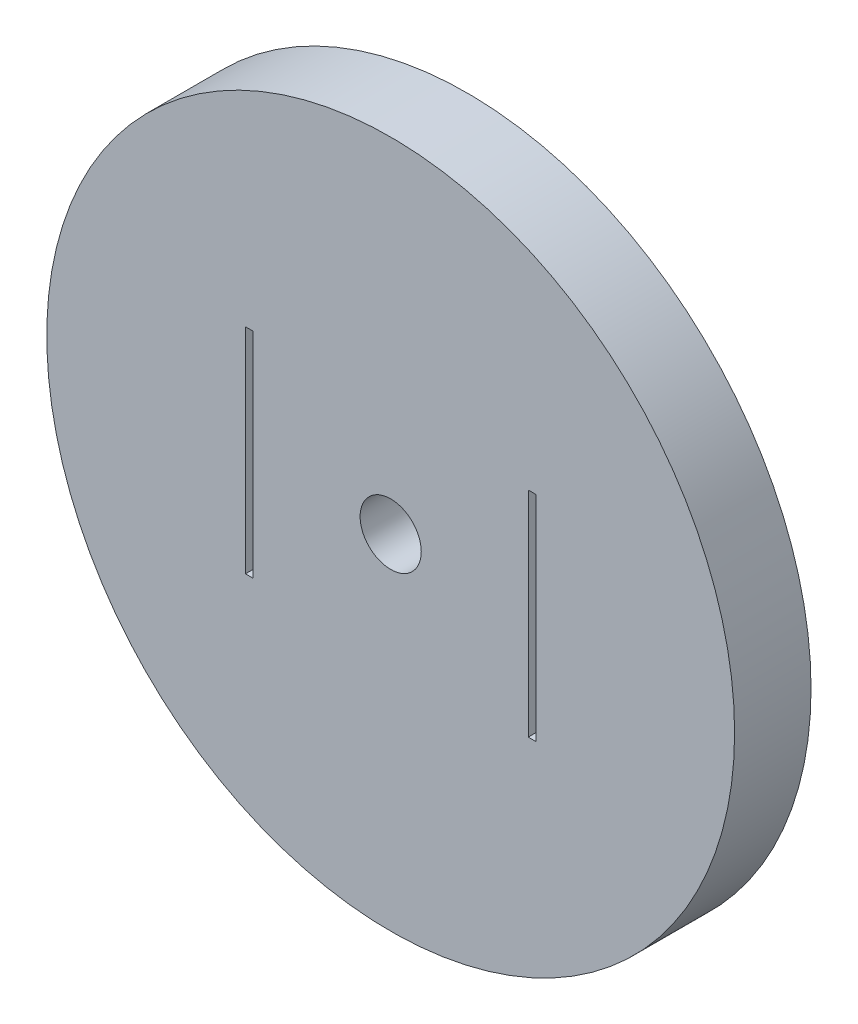
ISO-10303-21;
HEADER;
FILE_DESCRIPTION(('STEP AP214'),'2;1');
FILE_NAME('part.step','',(''),(''),'','','');
FILE_SCHEMA(('AUTOMOTIVE_DESIGN { 1 0 10303 214 1 1 1 1 }'));
ENDSEC;
DATA;
#1=APPLICATION_CONTEXT('core data for automotive mechanical design processes');
#2=APPLICATION_PROTOCOL_DEFINITION('international standard','automotive_design',2000,#1);
#3=PRODUCT_CONTEXT('',#1,'mechanical');
#4=PRODUCT('Part','Part','',(#3));
#5=PRODUCT_RELATED_PRODUCT_CATEGORY('part','',(#4));
#6=PRODUCT_DEFINITION_FORMATION('','',#4);
#7=PRODUCT_DEFINITION_CONTEXT('part definition',#1,'design');
#8=PRODUCT_DEFINITION('design','',#6,#7);
#9=PRODUCT_DEFINITION_SHAPE('','',#8);
#10=(LENGTH_UNIT() NAMED_UNIT(*) SI_UNIT(.MILLI.,.METRE.));
#11=(NAMED_UNIT(*) PLANE_ANGLE_UNIT() SI_UNIT($,.RADIAN.));
#12=(NAMED_UNIT(*) SI_UNIT($,.STERADIAN.) SOLID_ANGLE_UNIT());
#13=UNCERTAINTY_MEASURE_WITH_UNIT(LENGTH_MEASURE(1.E-05),#10,'distance_accuracy_value','');
#14=(GEOMETRIC_REPRESENTATION_CONTEXT(3) GLOBAL_UNCERTAINTY_ASSIGNED_CONTEXT((#13)) GLOBAL_UNIT_ASSIGNED_CONTEXT((#10,
#11,#12)) REPRESENTATION_CONTEXT('',''));
#15=CARTESIAN_POINT('',(0.,0.,0.));
#16=DIRECTION('',(0.,0.,1.));
#17=DIRECTION('',(1.,0.,0.));
#18=AXIS2_PLACEMENT_3D('',#15,#16,#17);
#19=CARTESIAN_POINT('',(0.,0.,5.));
#20=DIRECTION('',(0.,0.,1.));
#21=DIRECTION('',(1.,0.,0.));
#22=AXIS2_PLACEMENT_3D('',#19,#20,#21);
#23=PLANE('',#22);
#24=CARTESIAN_POINT('',(0.,0.,5.));
#25=DIRECTION('',(0.,0.,1.));
#26=DIRECTION('',(1.,0.,0.));
#27=AXIS2_PLACEMENT_3D('',#24,#25,#26);
#28=CIRCLE('',#27,22.5);
#29=CARTESIAN_POINT('',(22.5,0.,5.));
#30=VERTEX_POINT('',#29);
#31=EDGE_CURVE('E11',#30,#30,#28,.T.);
#32=ORIENTED_EDGE('',*,*,#31,.T.);
#33=EDGE_LOOP('',(#32));
#34=FACE_BOUND('',#33,.T.);
#35=CARTESIAN_POINT('',(0.,0.,5.));
#36=DIRECTION('',(0.,0.,1.));
#37=DIRECTION('',(1.,0.,0.));
#38=AXIS2_PLACEMENT_3D('',#35,#36,#37);
#39=CIRCLE('',#38,2.);
#40=CARTESIAN_POINT('',(2.,0.,5.));
#41=VERTEX_POINT('',#40);
#42=EDGE_CURVE('E167',#41,#41,#39,.T.);
#43=ORIENTED_EDGE('',*,*,#42,.F.);
#44=EDGE_LOOP('',(#43));
#45=FACE_BOUND('',#44,.T.);
#46=DIRECTION('',(1.,0.,0.));
#47=VECTOR('',#46,1.);
#48=CARTESIAN_POINT('',(-9.5,-7.,5.));
#49=LINE('',#48,#47);
#50=CARTESIAN_POINT('',(-9.5,-7.,5.));
#51=VERTEX_POINT('',#50);
#52=CARTESIAN_POINT('',(-9.,-7.,5.));
#53=VERTEX_POINT('',#52);
#54=EDGE_CURVE('E138',#51,#53,#49,.T.);
#55=ORIENTED_EDGE('',*,*,#54,.F.);
#56=DIRECTION('',(0.,-1.,0.));
#57=VECTOR('',#56,1.);
#58=CARTESIAN_POINT('',(-9.5,7.,5.));
#59=LINE('',#58,#57);
#60=CARTESIAN_POINT('',(-9.5,7.,5.));
#61=VERTEX_POINT('',#60);
#62=EDGE_CURVE('E136',#61,#51,#59,.T.);
#63=ORIENTED_EDGE('',*,*,#62,.F.);
#64=DIRECTION('',(-1.,0.,0.));
#65=VECTOR('',#64,1.);
#66=CARTESIAN_POINT('',(-9.5,7.,5.));
#67=LINE('',#66,#65);
#68=CARTESIAN_POINT('',(-9.,7.,5.));
#69=VERTEX_POINT('',#68);
#70=EDGE_CURVE('E144',#69,#61,#67,.T.);
#71=ORIENTED_EDGE('',*,*,#70,.F.);
#72=DIRECTION('',(0.,1.,0.));
#73=VECTOR('',#72,1.);
#74=CARTESIAN_POINT('',(-9.,7.,5.));
#75=LINE('',#74,#73);
#76=EDGE_CURVE('E141',#53,#69,#75,.T.);
#77=ORIENTED_EDGE('',*,*,#76,.F.);
#78=EDGE_LOOP('',(#55,#63,#71,#77));
#79=FACE_BOUND('',#78,.T.);
#80=DIRECTION('',(0.,-1.,0.));
#81=VECTOR('',#80,1.);
#82=CARTESIAN_POINT('',(9.,7.,5.));
#83=LINE('',#82,#81);
#84=CARTESIAN_POINT('',(9.,7.,5.));
#85=VERTEX_POINT('',#84);
#86=CARTESIAN_POINT('',(9.,-7.,5.));
#87=VERTEX_POINT('',#86);
#88=EDGE_CURVE('E106',#85,#87,#83,.T.);
#89=ORIENTED_EDGE('',*,*,#88,.F.);
#90=DIRECTION('',(-1.,0.,0.));
#91=VECTOR('',#90,1.);
#92=CARTESIAN_POINT('',(9.5,7.,5.));
#93=LINE('',#92,#91);
#94=CARTESIAN_POINT('',(9.5,7.,5.));
#95=VERTEX_POINT('',#94);
#96=EDGE_CURVE('E98',#95,#85,#93,.T.);
#97=ORIENTED_EDGE('',*,*,#96,.F.);
#98=DIRECTION('',(0.,1.,0.));
#99=VECTOR('',#98,1.);
#100=CARTESIAN_POINT('',(9.5,7.,5.));
#101=LINE('',#100,#99);
#102=CARTESIAN_POINT('',(9.5,-7.,5.));
#103=VERTEX_POINT('',#102);
#104=EDGE_CURVE('E120',#103,#95,#101,.T.);
#105=ORIENTED_EDGE('',*,*,#104,.F.);
#106=DIRECTION('',(1.,0.,0.));
#107=VECTOR('',#106,1.);
#108=CARTESIAN_POINT('',(9.5,-7.,5.));
#109=LINE('',#108,#107);
#110=EDGE_CURVE('E118',#87,#103,#109,.T.);
#111=ORIENTED_EDGE('',*,*,#110,.F.);
#112=EDGE_LOOP('',(#89,#97,#105,#111));
#113=FACE_BOUND('',#112,.T.);
#114=ADVANCED_FACE('F33',(#34,#45,#79,#113),#23,.T.);
#115=CARTESIAN_POINT('',(0.,0.,0.));
#116=DIRECTION('',(0.,0.,1.));
#117=DIRECTION('',(1.,0.,0.));
#118=AXIS2_PLACEMENT_3D('',#115,#116,#117);
#119=PLANE('',#118);
#120=CARTESIAN_POINT('',(-14.5,0.,0.));
#121=DIRECTION('',(0.,0.,-1.));
#122=DIRECTION('',(-1.,0.,0.));
#123=AXIS2_PLACEMENT_3D('',#120,#121,#122);
#124=CIRCLE('',#123,2.5);
#125=CARTESIAN_POINT('',(-17.,0.,0.));
#126=VERTEX_POINT('',#125);
#127=EDGE_CURVE('E126',#126,#126,#124,.T.);
#128=ORIENTED_EDGE('',*,*,#127,.F.);
#129=EDGE_LOOP('',(#128));
#130=FACE_BOUND('',#129,.T.);
#131=DIRECTION('',(0.,-1.,0.));
#132=VECTOR('',#131,1.);
#133=CARTESIAN_POINT('',(-9.5,7.,0.));
#134=LINE('',#133,#132);
#135=CARTESIAN_POINT('',(-9.5,7.,0.));
#136=VERTEX_POINT('',#135);
#137=CARTESIAN_POINT('',(-9.5,-7.,0.));
#138=VERTEX_POINT('',#137);
#139=EDGE_CURVE('E114',#136,#138,#134,.T.);
#140=ORIENTED_EDGE('',*,*,#139,.T.);
#141=DIRECTION('',(1.,0.,0.));
#142=VECTOR('',#141,1.);
#143=CARTESIAN_POINT('',(-9.5,-7.,0.));
#144=LINE('',#143,#142);
#145=CARTESIAN_POINT('',(-9.,-7.,0.));
#146=VERTEX_POINT('',#145);
#147=EDGE_CURVE('E149',#138,#146,#144,.T.);
#148=ORIENTED_EDGE('',*,*,#147,.T.);
#149=DIRECTION('',(0.,1.,0.));
#150=VECTOR('',#149,1.);
#151=CARTESIAN_POINT('',(-9.,7.,0.));
#152=LINE('',#151,#150);
#153=CARTESIAN_POINT('',(-9.,7.,0.));
#154=VERTEX_POINT('',#153);
#155=EDGE_CURVE('E152',#146,#154,#152,.T.);
#156=ORIENTED_EDGE('',*,*,#155,.T.);
#157=DIRECTION('',(-1.,0.,0.));
#158=VECTOR('',#157,1.);
#159=CARTESIAN_POINT('',(-9.5,7.,0.));
#160=LINE('',#159,#158);
#161=EDGE_CURVE('E139',#154,#136,#160,.T.);
#162=ORIENTED_EDGE('',*,*,#161,.T.);
#163=EDGE_LOOP('',(#140,#148,#156,#162));
#164=FACE_BOUND('',#163,.T.);
#165=CARTESIAN_POINT('',(0.,0.,0.));
#166=DIRECTION('',(0.,0.,1.));
#167=DIRECTION('',(1.,0.,0.));
#168=AXIS2_PLACEMENT_3D('',#165,#166,#167);
#169=CIRCLE('',#168,22.5);
#170=CARTESIAN_POINT('',(22.5,0.,0.));
#171=VERTEX_POINT('',#170);
#172=EDGE_CURVE('E37',#171,#171,#169,.T.);
#173=ORIENTED_EDGE('',*,*,#172,.F.);
#174=EDGE_LOOP('',(#173));
#175=FACE_BOUND('',#174,.T.);
#176=CARTESIAN_POINT('',(0.,0.,0.));
#177=DIRECTION('',(0.,0.,1.));
#178=DIRECTION('',(1.,0.,0.));
#179=AXIS2_PLACEMENT_3D('',#176,#177,#178);
#180=CIRCLE('',#179,2.);
#181=CARTESIAN_POINT('',(2.,0.,0.));
#182=VERTEX_POINT('',#181);
#183=EDGE_CURVE('E166',#182,#182,#180,.T.);
#184=ORIENTED_EDGE('',*,*,#183,.T.);
#185=EDGE_LOOP('',(#184));
#186=FACE_BOUND('',#185,.T.);
#187=DIRECTION('',(-1.,0.,0.));
#188=VECTOR('',#187,1.);
#189=CARTESIAN_POINT('',(9.5,7.,0.));
#190=LINE('',#189,#188);
#191=CARTESIAN_POINT('',(9.5,7.,0.));
#192=VERTEX_POINT('',#191);
#193=CARTESIAN_POINT('',(9.,7.,0.));
#194=VERTEX_POINT('',#193);
#195=EDGE_CURVE('E56',#192,#194,#190,.T.);
#196=ORIENTED_EDGE('',*,*,#195,.T.);
#197=DIRECTION('',(0.,-1.,0.));
#198=VECTOR('',#197,1.);
#199=CARTESIAN_POINT('',(9.,7.,0.));
#200=LINE('',#199,#198);
#201=CARTESIAN_POINT('',(9.,-7.,0.));
#202=VERTEX_POINT('',#201);
#203=EDGE_CURVE('E113',#194,#202,#200,.T.);
#204=ORIENTED_EDGE('',*,*,#203,.T.);
#205=DIRECTION('',(1.,0.,0.));
#206=VECTOR('',#205,1.);
#207=CARTESIAN_POINT('',(9.5,-7.,0.));
#208=LINE('',#207,#206);
#209=CARTESIAN_POINT('',(9.5,-7.,0.));
#210=VERTEX_POINT('',#209);
#211=EDGE_CURVE('E128',#202,#210,#208,.T.);
#212=ORIENTED_EDGE('',*,*,#211,.T.);
#213=DIRECTION('',(0.,1.,0.));
#214=VECTOR('',#213,1.);
#215=CARTESIAN_POINT('',(9.5,7.,0.));
#216=LINE('',#215,#214);
#217=EDGE_CURVE('E107',#210,#192,#216,.T.);
#218=ORIENTED_EDGE('',*,*,#217,.T.);
#219=EDGE_LOOP('',(#196,#204,#212,#218));
#220=FACE_BOUND('',#219,.T.);
#221=ADVANCED_FACE('F173',(#130,#164,#175,#186,#220),#119,.F.);
#222=CARTESIAN_POINT('',(0.,0.,5.));
#223=DIRECTION('',(0.,0.,-1.));
#224=DIRECTION('',(-1.,0.,0.));
#225=AXIS2_PLACEMENT_3D('',#222,#223,#224);
#226=CYLINDRICAL_SURFACE('',#225,22.5);
#227=ORIENTED_EDGE('',*,*,#31,.F.);
#228=EDGE_LOOP('',(#227));
#229=FACE_BOUND('',#228,.T.);
#230=ORIENTED_EDGE('',*,*,#172,.T.);
#231=EDGE_LOOP('',(#230));
#232=FACE_BOUND('',#231,.T.);
#233=ADVANCED_FACE('F35',(#229,#232),#226,.T.);
#234=CARTESIAN_POINT('',(0.,0.,5.));
#235=DIRECTION('',(0.,0.,-1.));
#236=DIRECTION('',(-1.,0.,0.));
#237=AXIS2_PLACEMENT_3D('',#234,#235,#236);
#238=CYLINDRICAL_SURFACE('',#237,2.);
#239=ORIENTED_EDGE('',*,*,#42,.T.);
#240=EDGE_LOOP('',(#239));
#241=FACE_BOUND('',#240,.T.);
#242=ORIENTED_EDGE('',*,*,#183,.F.);
#243=EDGE_LOOP('',(#242));
#244=FACE_BOUND('',#243,.T.);
#245=ADVANCED_FACE('F176',(#241,#244),#238,.F.);
#246=CARTESIAN_POINT('',(-9.5,7.,5.));
#247=DIRECTION('',(1.,0.,0.));
#248=DIRECTION('',(0.,1.,0.));
#249=AXIS2_PLACEMENT_3D('',#246,#247,#248);
#250=PLANE('',#249);
#251=ORIENTED_EDGE('',*,*,#139,.F.);
#252=DIRECTION('',(0.,0.,-1.));
#253=VECTOR('',#252,1.);
#254=CARTESIAN_POINT('',(-9.5,7.,5.));
#255=LINE('',#254,#253);
#256=EDGE_CURVE('E146',#61,#136,#255,.T.);
#257=ORIENTED_EDGE('',*,*,#256,.F.);
#258=ORIENTED_EDGE('',*,*,#62,.T.);
#259=DIRECTION('',(0.,0.,-1.));
#260=VECTOR('',#259,1.);
#261=CARTESIAN_POINT('',(-9.5,-7.,5.));
#262=LINE('',#261,#260);
#263=EDGE_CURVE('E163',#51,#138,#262,.T.);
#264=ORIENTED_EDGE('',*,*,#263,.T.);
#265=EDGE_LOOP('',(#251,#257,#258,#264));
#266=FACE_BOUND('',#265,.T.);
#267=ADVANCED_FACE('F178',(#266),#250,.T.);
#268=CARTESIAN_POINT('',(-9.5,-7.,5.));
#269=DIRECTION('',(0.,1.,0.));
#270=DIRECTION('',(-1.,0.,0.));
#271=AXIS2_PLACEMENT_3D('',#268,#269,#270);
#272=PLANE('',#271);
#273=ORIENTED_EDGE('',*,*,#147,.F.);
#274=ORIENTED_EDGE('',*,*,#263,.F.);
#275=ORIENTED_EDGE('',*,*,#54,.T.);
#276=DIRECTION('',(0.,0.,-1.));
#277=VECTOR('',#276,1.);
#278=CARTESIAN_POINT('',(-9.,-7.,5.));
#279=LINE('',#278,#277);
#280=EDGE_CURVE('E161',#53,#146,#279,.T.);
#281=ORIENTED_EDGE('',*,*,#280,.T.);
#282=EDGE_LOOP('',(#273,#274,#275,#281));
#283=FACE_BOUND('',#282,.T.);
#284=ADVANCED_FACE('F185',(#283),#272,.T.);
#285=CARTESIAN_POINT('',(-9.,7.,5.));
#286=DIRECTION('',(-1.,0.,0.));
#287=DIRECTION('',(0.,-1.,0.));
#288=AXIS2_PLACEMENT_3D('',#285,#286,#287);
#289=PLANE('',#288);
#290=ORIENTED_EDGE('',*,*,#155,.F.);
#291=ORIENTED_EDGE('',*,*,#280,.F.);
#292=ORIENTED_EDGE('',*,*,#76,.T.);
#293=DIRECTION('',(0.,0.,-1.));
#294=VECTOR('',#293,1.);
#295=CARTESIAN_POINT('',(-9.,7.,5.));
#296=LINE('',#295,#294);
#297=EDGE_CURVE('E159',#69,#154,#296,.T.);
#298=ORIENTED_EDGE('',*,*,#297,.T.);
#299=EDGE_LOOP('',(#290,#291,#292,#298));
#300=FACE_BOUND('',#299,.T.);
#301=ADVANCED_FACE('F209',(#300),#289,.T.);
#302=CARTESIAN_POINT('',(-9.5,7.,5.));
#303=DIRECTION('',(0.,-1.,0.));
#304=DIRECTION('',(0.,0.,-1.));
#305=AXIS2_PLACEMENT_3D('',#302,#303,#304);
#306=PLANE('',#305);
#307=ORIENTED_EDGE('',*,*,#161,.F.);
#308=ORIENTED_EDGE('',*,*,#297,.F.);
#309=ORIENTED_EDGE('',*,*,#70,.T.);
#310=ORIENTED_EDGE('',*,*,#256,.T.);
#311=EDGE_LOOP('',(#307,#308,#309,#310));
#312=FACE_BOUND('',#311,.T.);
#313=ADVANCED_FACE('F215',(#312),#306,.T.);
#314=CARTESIAN_POINT('',(9.5,7.,5.));
#315=DIRECTION('',(0.,-1.,0.));
#316=DIRECTION('',(0.,0.,-1.));
#317=AXIS2_PLACEMENT_3D('',#314,#315,#316);
#318=PLANE('',#317);
#319=ORIENTED_EDGE('',*,*,#195,.F.);
#320=DIRECTION('',(0.,0.,-1.));
#321=VECTOR('',#320,1.);
#322=CARTESIAN_POINT('',(9.5,7.,5.));
#323=LINE('',#322,#321);
#324=EDGE_CURVE('E102',#95,#192,#323,.T.);
#325=ORIENTED_EDGE('',*,*,#324,.F.);
#326=ORIENTED_EDGE('',*,*,#96,.T.);
#327=DIRECTION('',(0.,0.,-1.));
#328=VECTOR('',#327,1.);
#329=CARTESIAN_POINT('',(9.,7.,5.));
#330=LINE('',#329,#328);
#331=EDGE_CURVE('E101',#85,#194,#330,.T.);
#332=ORIENTED_EDGE('',*,*,#331,.T.);
#333=EDGE_LOOP('',(#319,#325,#326,#332));
#334=FACE_BOUND('',#333,.T.);
#335=ADVANCED_FACE('F100',(#334),#318,.T.);
#336=CARTESIAN_POINT('',(9.,7.,5.));
#337=DIRECTION('',(1.,0.,0.));
#338=DIRECTION('',(0.,1.,0.));
#339=AXIS2_PLACEMENT_3D('',#336,#337,#338);
#340=PLANE('',#339);
#341=ORIENTED_EDGE('',*,*,#203,.F.);
#342=ORIENTED_EDGE('',*,*,#331,.F.);
#343=ORIENTED_EDGE('',*,*,#88,.T.);
#344=DIRECTION('',(0.,0.,-1.));
#345=VECTOR('',#344,1.);
#346=CARTESIAN_POINT('',(9.,-7.,5.));
#347=LINE('',#346,#345);
#348=EDGE_CURVE('E115',#87,#202,#347,.T.);
#349=ORIENTED_EDGE('',*,*,#348,.T.);
#350=EDGE_LOOP('',(#341,#342,#343,#349));
#351=FACE_BOUND('',#350,.T.);
#352=ADVANCED_FACE('F110',(#351),#340,.T.);
#353=CARTESIAN_POINT('',(9.5,-7.,5.));
#354=DIRECTION('',(0.,1.,0.));
#355=DIRECTION('',(-1.,0.,0.));
#356=AXIS2_PLACEMENT_3D('',#353,#354,#355);
#357=PLANE('',#356);
#358=ORIENTED_EDGE('',*,*,#211,.F.);
#359=ORIENTED_EDGE('',*,*,#348,.F.);
#360=ORIENTED_EDGE('',*,*,#110,.T.);
#361=DIRECTION('',(0.,0.,-1.));
#362=VECTOR('',#361,1.);
#363=CARTESIAN_POINT('',(9.5,-7.,5.));
#364=LINE('',#363,#362);
#365=EDGE_CURVE('E48',#103,#210,#364,.T.);
#366=ORIENTED_EDGE('',*,*,#365,.T.);
#367=EDGE_LOOP('',(#358,#359,#360,#366));
#368=FACE_BOUND('',#367,.T.);
#369=ADVANCED_FACE('F254',(#368),#357,.T.);
#370=CARTESIAN_POINT('',(9.5,7.,5.));
#371=DIRECTION('',(-1.,0.,0.));
#372=DIRECTION('',(0.,-1.,0.));
#373=AXIS2_PLACEMENT_3D('',#370,#371,#372);
#374=PLANE('',#373);
#375=ORIENTED_EDGE('',*,*,#217,.F.);
#376=ORIENTED_EDGE('',*,*,#365,.F.);
#377=ORIENTED_EDGE('',*,*,#104,.T.);
#378=ORIENTED_EDGE('',*,*,#324,.T.);
#379=EDGE_LOOP('',(#375,#376,#377,#378));
#380=FACE_BOUND('',#379,.T.);
#381=ADVANCED_FACE('F262',(#380),#374,.T.);
#382=CARTESIAN_POINT('',(-14.5,0.,-6.));
#383=DIRECTION('',(0.,0.,-1.));
#384=DIRECTION('',(-1.,0.,0.));
#385=AXIS2_PLACEMENT_3D('',#382,#383,#384);
#386=CYLINDRICAL_SURFACE('',#385,2.5);
#387=ORIENTED_EDGE('',*,*,#127,.T.);
#388=EDGE_LOOP('',(#387));
#389=FACE_BOUND('',#388,.T.);
#390=CARTESIAN_POINT('',(-14.5,0.,-6.));
#391=DIRECTION('',(0.,0.,-1.));
#392=DIRECTION('',(-1.,0.,0.));
#393=AXIS2_PLACEMENT_3D('',#390,#391,#392);
#394=CIRCLE('',#393,2.5);
#395=CARTESIAN_POINT('',(-17.,0.,-6.));
#396=VERTEX_POINT('',#395);
#397=EDGE_CURVE('E305',#396,#396,#394,.T.);
#398=ORIENTED_EDGE('',*,*,#397,.F.);
#399=EDGE_LOOP('',(#398));
#400=FACE_BOUND('',#399,.T.);
#401=ADVANCED_FACE('F272',(#389,#400),#386,.T.);
#402=CARTESIAN_POINT('',(-14.5,0.,-6.));
#403=DIRECTION('',(0.,0.,-1.));
#404=DIRECTION('',(-1.,0.,0.));
#405=AXIS2_PLACEMENT_3D('',#402,#403,#404);
#406=SPHERICAL_SURFACE('',#405,2.5);
#407=ORIENTED_EDGE('',*,*,#397,.T.);
#408=EDGE_LOOP('',(#407));
#409=FACE_BOUND('',#408,.T.);
#410=ADVANCED_FACE('F289',(#409),#406,.T.);
#411=CLOSED_SHELL('',(#114,#221,#233,#245,#267,#284,#301,#313,#335,#352,#369,#381,#401,#410));
#412=MANIFOLD_SOLID_BREP('B2',#411);
#413=ADVANCED_BREP_SHAPE_REPRESENTATION('',(#18,#412),#14);
#414=SHAPE_DEFINITION_REPRESENTATION(#9,#413);
ENDSEC;
END-ISO-10303-21;
